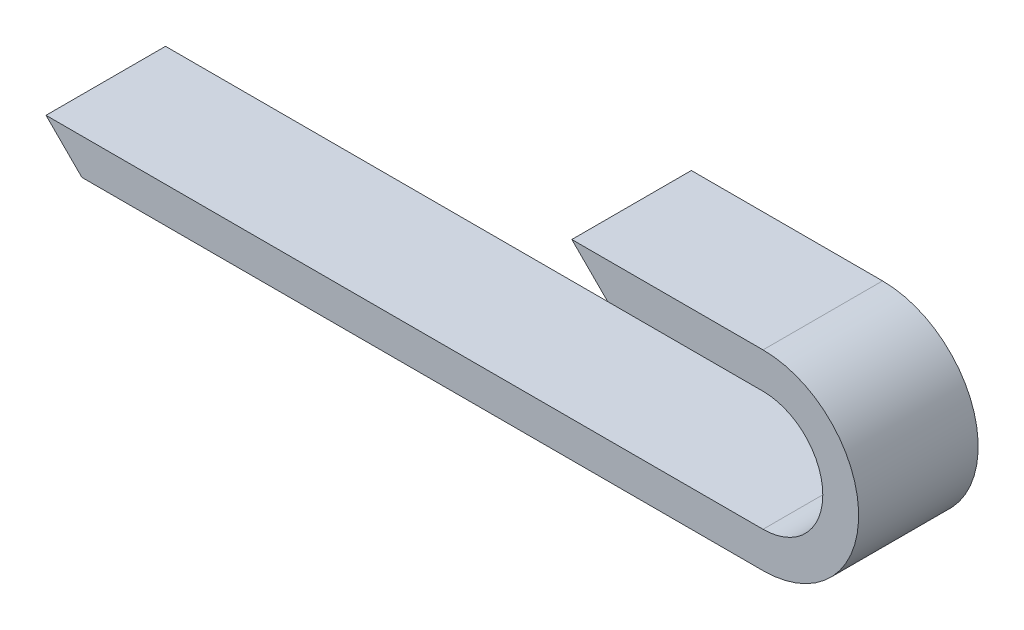
ISO-10303-21;
HEADER;
FILE_DESCRIPTION(('STEP AP214'),'2;1');
FILE_NAME('part.step','',(''),(''),'','','');
FILE_SCHEMA(('AUTOMOTIVE_DESIGN { 1 0 10303 214 1 1 1 1 }'));
ENDSEC;
DATA;
#1=APPLICATION_CONTEXT('core data for automotive mechanical design processes');
#2=APPLICATION_PROTOCOL_DEFINITION('international standard','automotive_design',2000,#1);
#3=PRODUCT_CONTEXT('',#1,'mechanical');
#4=PRODUCT('Part','Part','',(#3));
#5=PRODUCT_RELATED_PRODUCT_CATEGORY('part','',(#4));
#6=PRODUCT_DEFINITION_FORMATION('','',#4);
#7=PRODUCT_DEFINITION_CONTEXT('part definition',#1,'design');
#8=PRODUCT_DEFINITION('design','',#6,#7);
#9=PRODUCT_DEFINITION_SHAPE('','',#8);
#10=(LENGTH_UNIT() NAMED_UNIT(*) SI_UNIT(.MILLI.,.METRE.));
#11=(NAMED_UNIT(*) PLANE_ANGLE_UNIT() SI_UNIT($,.RADIAN.));
#12=(NAMED_UNIT(*) SI_UNIT($,.STERADIAN.) SOLID_ANGLE_UNIT());
#13=UNCERTAINTY_MEASURE_WITH_UNIT(LENGTH_MEASURE(1.E-05),#10,'distance_accuracy_value','');
#14=(GEOMETRIC_REPRESENTATION_CONTEXT(3) GLOBAL_UNCERTAINTY_ASSIGNED_CONTEXT((#13)) GLOBAL_UNIT_ASSIGNED_CONTEXT((#10,
#11,#12)) REPRESENTATION_CONTEXT('',''));
#15=CARTESIAN_POINT('',(0.,0.,0.));
#16=DIRECTION('',(0.,0.,1.));
#17=DIRECTION('',(1.,0.,0.));
#18=AXIS2_PLACEMENT_3D('',#15,#16,#17);
#19=CARTESIAN_POINT('',(325.210180135895,8.42588024175691,-85.));
#20=DIRECTION('',(0.,0.,1.));
#21=DIRECTION('',(1.,0.,0.));
#22=AXIS2_PLACEMENT_3D('',#19,#20,#21);
#23=CYLINDRICAL_SURFACE('',#22,68.);
#24=CARTESIAN_POINT('',(325.210180135895,8.42588024175691,0.));
#25=DIRECTION('',(0.,0.,1.));
#26=DIRECTION('',(1.,0.,0.));
#27=AXIS2_PLACEMENT_3D('',#24,#25,#26);
#28=CIRCLE('',#27,68.);
#29=CARTESIAN_POINT('',(325.210180135895,76.4258802417569,0.));
#30=VERTEX_POINT('',#29);
#31=CARTESIAN_POINT('',(325.210180135895,-59.5741197582431,0.));
#32=VERTEX_POINT('',#31);
#33=EDGE_CURVE('E135',#30,#32,#28,.F.);
#34=ORIENTED_EDGE('',*,*,#33,.T.);
#35=DIRECTION('',(0.,0.,1.));
#36=VECTOR('',#35,1.);
#37=CARTESIAN_POINT('',(325.210180135895,-59.5741197582431,-85.));
#38=LINE('',#37,#36);
#39=CARTESIAN_POINT('',(325.210180135895,-59.5741197582431,-85.));
#40=VERTEX_POINT('',#39);
#41=EDGE_CURVE('E11',#40,#32,#38,.T.);
#42=ORIENTED_EDGE('',*,*,#41,.F.);
#43=CARTESIAN_POINT('',(325.210180135895,8.42588024175691,-85.));
#44=DIRECTION('',(0.,0.,1.));
#45=DIRECTION('',(1.,0.,0.));
#46=AXIS2_PLACEMENT_3D('',#43,#44,#45);
#47=CIRCLE('',#46,68.);
#48=CARTESIAN_POINT('',(325.210180135895,76.4258802417569,-85.));
#49=VERTEX_POINT('',#48);
#50=EDGE_CURVE('E153',#49,#40,#47,.F.);
#51=ORIENTED_EDGE('',*,*,#50,.F.);
#52=DIRECTION('',(0.,0.,1.));
#53=VECTOR('',#52,1.);
#54=CARTESIAN_POINT('',(325.210180135895,76.4258802417569,-85.));
#55=LINE('',#54,#53);
#56=EDGE_CURVE('E41',#49,#30,#55,.T.);
#57=ORIENTED_EDGE('',*,*,#56,.T.);
#58=EDGE_LOOP('',(#34,#42,#51,#57));
#59=FACE_BOUND('',#58,.T.);
#60=ADVANCED_FACE('F38',(#59),#23,.T.);
#61=CARTESIAN_POINT('',(0.,-59.5741197582431,-85.));
#62=DIRECTION('',(0.,1.,0.));
#63=DIRECTION('',(-1.,0.,0.));
#64=AXIS2_PLACEMENT_3D('',#61,#62,#63);
#65=PLANE('',#64);
#66=DIRECTION('',(-1.,0.,0.));
#67=VECTOR('',#66,1.);
#68=CARTESIAN_POINT('',(0.,-59.5741197582431,0.));
#69=LINE('',#68,#67);
#70=CARTESIAN_POINT('',(-159.289819864105,-59.5741197582431,0.));
#71=VERTEX_POINT('',#70);
#72=EDGE_CURVE('E81',#32,#71,#69,.T.);
#73=ORIENTED_EDGE('',*,*,#72,.T.);
#74=DIRECTION('',(0.,0.,1.));
#75=VECTOR('',#74,1.);
#76=CARTESIAN_POINT('',(-159.289819864105,-59.5741197582431,-85.));
#77=LINE('',#76,#75);
#78=CARTESIAN_POINT('',(-159.289819864105,-59.5741197582431,-85.));
#79=VERTEX_POINT('',#78);
#80=EDGE_CURVE('E47',#79,#71,#77,.T.);
#81=ORIENTED_EDGE('',*,*,#80,.F.);
#82=DIRECTION('',(-1.,0.,0.));
#83=VECTOR('',#82,1.);
#84=CARTESIAN_POINT('',(0.,-59.5741197582431,-85.));
#85=LINE('',#84,#83);
#86=EDGE_CURVE('E55',#40,#79,#85,.T.);
#87=ORIENTED_EDGE('',*,*,#86,.F.);
#88=ORIENTED_EDGE('',*,*,#41,.T.);
#89=EDGE_LOOP('',(#73,#81,#87,#88));
#90=FACE_BOUND('',#89,.T.);
#91=ADVANCED_FACE('F178',(#90),#65,.F.);
#92=CARTESIAN_POINT('',(-109.431969811174,-109.431969811174,-85.));
#93=DIRECTION('',(0.707106781186548,0.707106781186548,0.));
#94=DIRECTION('',(-0.707106781186548,0.707106781186548,0.));
#95=AXIS2_PLACEMENT_3D('',#92,#93,#94);
#96=PLANE('',#95);
#97=DIRECTION('',(-0.707106781186548,0.707106781186548,0.));
#98=VECTOR('',#97,1.);
#99=CARTESIAN_POINT('',(-109.431969811174,-109.431969811174,0.));
#100=LINE('',#99,#98);
#101=CARTESIAN_POINT('',(-184.789819864105,-34.0741197582431,0.));
#102=VERTEX_POINT('',#101);
#103=EDGE_CURVE('E120',#71,#102,#100,.T.);
#104=ORIENTED_EDGE('',*,*,#103,.T.);
#105=DIRECTION('',(0.,0.,1.));
#106=VECTOR('',#105,1.);
#107=CARTESIAN_POINT('',(-184.789819864105,-34.0741197582431,-85.));
#108=LINE('',#107,#106);
#109=CARTESIAN_POINT('',(-184.789819864105,-34.0741197582431,-85.));
#110=VERTEX_POINT('',#109);
#111=EDGE_CURVE('E118',#110,#102,#108,.T.);
#112=ORIENTED_EDGE('',*,*,#111,.F.);
#113=DIRECTION('',(-0.707106781186548,0.707106781186548,0.));
#114=VECTOR('',#113,1.);
#115=CARTESIAN_POINT('',(-109.431969811174,-109.431969811174,-85.));
#116=LINE('',#115,#114);
#117=EDGE_CURVE('E108',#79,#110,#116,.T.);
#118=ORIENTED_EDGE('',*,*,#117,.F.);
#119=ORIENTED_EDGE('',*,*,#80,.T.);
#120=EDGE_LOOP('',(#104,#112,#118,#119));
#121=FACE_BOUND('',#120,.T.);
#122=ADVANCED_FACE('F119',(#121),#96,.F.);
#123=CARTESIAN_POINT('',(0.,-34.0741197582431,-85.));
#124=DIRECTION('',(0.,-1.,0.));
#125=DIRECTION('',(1.,0.,0.));
#126=AXIS2_PLACEMENT_3D('',#123,#124,#125);
#127=PLANE('',#126);
#128=DIRECTION('',(1.,0.,0.));
#129=VECTOR('',#128,1.);
#130=CARTESIAN_POINT('',(0.,-34.0741197582431,0.));
#131=LINE('',#130,#129);
#132=CARTESIAN_POINT('',(325.210180135895,-34.0741197582431,0.));
#133=VERTEX_POINT('',#132);
#134=EDGE_CURVE('E150',#102,#133,#131,.T.);
#135=ORIENTED_EDGE('',*,*,#134,.T.);
#136=DIRECTION('',(0.,0.,1.));
#137=VECTOR('',#136,1.);
#138=CARTESIAN_POINT('',(325.210180135895,-34.0741197582431,-85.));
#139=LINE('',#138,#137);
#140=CARTESIAN_POINT('',(325.210180135895,-34.0741197582431,-85.));
#141=VERTEX_POINT('',#140);
#142=EDGE_CURVE('E124',#141,#133,#139,.T.);
#143=ORIENTED_EDGE('',*,*,#142,.F.);
#144=DIRECTION('',(1.,0.,0.));
#145=VECTOR('',#144,1.);
#146=CARTESIAN_POINT('',(0.,-34.0741197582431,-85.));
#147=LINE('',#146,#145);
#148=EDGE_CURVE('E113',#110,#141,#147,.T.);
#149=ORIENTED_EDGE('',*,*,#148,.F.);
#150=ORIENTED_EDGE('',*,*,#111,.T.);
#151=EDGE_LOOP('',(#135,#143,#149,#150));
#152=FACE_BOUND('',#151,.T.);
#153=ADVANCED_FACE('F126',(#152),#127,.F.);
#154=CARTESIAN_POINT('',(325.210180135895,8.42588024175691,-85.));
#155=DIRECTION('',(0.,0.,1.));
#156=DIRECTION('',(1.,0.,0.));
#157=AXIS2_PLACEMENT_3D('',#154,#155,#156);
#158=CYLINDRICAL_SURFACE('',#157,42.5);
#159=CARTESIAN_POINT('',(325.210180135895,8.42588024175691,0.));
#160=DIRECTION('',(0.,0.,1.));
#161=DIRECTION('',(1.,0.,0.));
#162=AXIS2_PLACEMENT_3D('',#159,#160,#161);
#163=CIRCLE('',#162,42.5);
#164=CARTESIAN_POINT('',(325.210180135895,50.9258802417569,0.));
#165=VERTEX_POINT('',#164);
#166=EDGE_CURVE('E147',#165,#133,#163,.F.);
#167=ORIENTED_EDGE('',*,*,#166,.F.);
#168=DIRECTION('',(0.,0.,1.));
#169=VECTOR('',#168,1.);
#170=CARTESIAN_POINT('',(325.210180135895,50.9258802417569,-85.));
#171=LINE('',#170,#169);
#172=CARTESIAN_POINT('',(325.210180135895,50.9258802417569,-85.));
#173=VERTEX_POINT('',#172);
#174=EDGE_CURVE('E157',#173,#165,#171,.T.);
#175=ORIENTED_EDGE('',*,*,#174,.F.);
#176=CARTESIAN_POINT('',(325.210180135895,8.42588024175691,-85.));
#177=DIRECTION('',(0.,0.,1.));
#178=DIRECTION('',(1.,0.,0.));
#179=AXIS2_PLACEMENT_3D('',#176,#177,#178);
#180=CIRCLE('',#179,42.5);
#181=EDGE_CURVE('E128',#173,#141,#180,.F.);
#182=ORIENTED_EDGE('',*,*,#181,.T.);
#183=ORIENTED_EDGE('',*,*,#142,.T.);
#184=EDGE_LOOP('',(#167,#175,#182,#183));
#185=FACE_BOUND('',#184,.T.);
#186=ADVANCED_FACE('F191',(#185),#158,.F.);
#187=CARTESIAN_POINT('',(0.,50.9258802417569,-85.));
#188=DIRECTION('',(0.,1.,0.));
#189=DIRECTION('',(-1.,0.,0.));
#190=AXIS2_PLACEMENT_3D('',#187,#188,#189);
#191=PLANE('',#190);
#192=DIRECTION('',(-1.,0.,0.));
#193=VECTOR('',#192,1.);
#194=CARTESIAN_POINT('',(0.,50.9258802417569,0.));
#195=LINE('',#194,#193);
#196=CARTESIAN_POINT('',(214.710180135895,50.9258802417569,0.));
#197=VERTEX_POINT('',#196);
#198=EDGE_CURVE('E144',#165,#197,#195,.T.);
#199=ORIENTED_EDGE('',*,*,#198,.T.);
#200=DIRECTION('',(0.,0.,1.));
#201=VECTOR('',#200,1.);
#202=CARTESIAN_POINT('',(214.710180135895,50.9258802417569,-85.));
#203=LINE('',#202,#201);
#204=CARTESIAN_POINT('',(214.710180135895,50.9258802417569,-85.));
#205=VERTEX_POINT('',#204);
#206=EDGE_CURVE('E159',#205,#197,#203,.T.);
#207=ORIENTED_EDGE('',*,*,#206,.F.);
#208=DIRECTION('',(-1.,0.,0.));
#209=VECTOR('',#208,1.);
#210=CARTESIAN_POINT('',(0.,50.9258802417569,-85.));
#211=LINE('',#210,#209);
#212=EDGE_CURVE('E130',#173,#205,#211,.T.);
#213=ORIENTED_EDGE('',*,*,#212,.F.);
#214=ORIENTED_EDGE('',*,*,#174,.T.);
#215=EDGE_LOOP('',(#199,#207,#213,#214));
#216=FACE_BOUND('',#215,.T.);
#217=ADVANCED_FACE('F174',(#216),#191,.F.);
#218=CARTESIAN_POINT('',(132.818030188825,132.818030188826,-85.));
#219=DIRECTION('',(-0.707106781186547,-0.707106781186548,0.));
#220=DIRECTION('',(0.707106781186548,-0.707106781186547,0.));
#221=AXIS2_PLACEMENT_3D('',#218,#219,#220);
#222=PLANE('',#221);
#223=DIRECTION('',(0.707106781186548,-0.707106781186547,0.));
#224=VECTOR('',#223,1.);
#225=CARTESIAN_POINT('',(132.818030188825,132.818030188826,0.));
#226=LINE('',#225,#224);
#227=CARTESIAN_POINT('',(189.210180135895,76.4258802417569,0.));
#228=VERTEX_POINT('',#227);
#229=EDGE_CURVE('E141',#228,#197,#226,.T.);
#230=ORIENTED_EDGE('',*,*,#229,.F.);
#231=DIRECTION('',(0.,0.,1.));
#232=VECTOR('',#231,1.);
#233=CARTESIAN_POINT('',(189.210180135895,76.4258802417569,-85.));
#234=LINE('',#233,#232);
#235=CARTESIAN_POINT('',(189.210180135895,76.4258802417569,-85.));
#236=VERTEX_POINT('',#235);
#237=EDGE_CURVE('E160',#236,#228,#234,.T.);
#238=ORIENTED_EDGE('',*,*,#237,.F.);
#239=DIRECTION('',(0.707106781186548,-0.707106781186547,0.));
#240=VECTOR('',#239,1.);
#241=CARTESIAN_POINT('',(132.818030188825,132.818030188826,-85.));
#242=LINE('',#241,#240);
#243=EDGE_CURVE('E205',#236,#205,#242,.T.);
#244=ORIENTED_EDGE('',*,*,#243,.T.);
#245=ORIENTED_EDGE('',*,*,#206,.T.);
#246=EDGE_LOOP('',(#230,#238,#244,#245));
#247=FACE_BOUND('',#246,.T.);
#248=ADVANCED_FACE('F168',(#247),#222,.T.);
#249=CARTESIAN_POINT('',(0.,76.4258802417569,-85.));
#250=DIRECTION('',(0.,1.,0.));
#251=DIRECTION('',(-1.,0.,0.));
#252=AXIS2_PLACEMENT_3D('',#249,#250,#251);
#253=PLANE('',#252);
#254=DIRECTION('',(-1.,0.,0.));
#255=VECTOR('',#254,1.);
#256=CARTESIAN_POINT('',(0.,76.4258802417569,0.));
#257=LINE('',#256,#255);
#258=EDGE_CURVE('E138',#30,#228,#257,.T.);
#259=ORIENTED_EDGE('',*,*,#258,.F.);
#260=ORIENTED_EDGE('',*,*,#56,.F.);
#261=DIRECTION('',(-1.,0.,0.));
#262=VECTOR('',#261,1.);
#263=CARTESIAN_POINT('',(0.,76.4258802417569,-85.));
#264=LINE('',#263,#262);
#265=EDGE_CURVE('E206',#49,#236,#264,.T.);
#266=ORIENTED_EDGE('',*,*,#265,.T.);
#267=ORIENTED_EDGE('',*,*,#237,.T.);
#268=EDGE_LOOP('',(#259,#260,#266,#267));
#269=FACE_BOUND('',#268,.T.);
#270=ADVANCED_FACE('F166',(#269),#253,.T.);
#271=CARTESIAN_POINT('',(0.,0.,-85.));
#272=DIRECTION('',(0.,0.,1.));
#273=DIRECTION('',(1.,0.,0.));
#274=AXIS2_PLACEMENT_3D('',#271,#272,#273);
#275=PLANE('',#274);
#276=ORIENTED_EDGE('',*,*,#50,.T.);
#277=ORIENTED_EDGE('',*,*,#86,.T.);
#278=ORIENTED_EDGE('',*,*,#117,.T.);
#279=ORIENTED_EDGE('',*,*,#148,.T.);
#280=ORIENTED_EDGE('',*,*,#181,.F.);
#281=ORIENTED_EDGE('',*,*,#212,.T.);
#282=ORIENTED_EDGE('',*,*,#243,.F.);
#283=ORIENTED_EDGE('',*,*,#265,.F.);
#284=EDGE_LOOP('',(#276,#277,#278,#279,#280,#281,#282,#283));
#285=FACE_BOUND('',#284,.T.);
#286=ADVANCED_FACE('F110',(#285),#275,.F.);
#287=CARTESIAN_POINT('',(0.,0.,0.));
#288=DIRECTION('',(0.,0.,1.));
#289=DIRECTION('',(1.,0.,0.));
#290=AXIS2_PLACEMENT_3D('',#287,#288,#289);
#291=PLANE('',#290);
#292=ORIENTED_EDGE('',*,*,#33,.F.);
#293=ORIENTED_EDGE('',*,*,#258,.T.);
#294=ORIENTED_EDGE('',*,*,#229,.T.);
#295=ORIENTED_EDGE('',*,*,#198,.F.);
#296=ORIENTED_EDGE('',*,*,#166,.T.);
#297=ORIENTED_EDGE('',*,*,#134,.F.);
#298=ORIENTED_EDGE('',*,*,#103,.F.);
#299=ORIENTED_EDGE('',*,*,#72,.F.);
#300=EDGE_LOOP('',(#292,#293,#294,#295,#296,#297,#298,#299));
#301=FACE_BOUND('',#300,.T.);
#302=ADVANCED_FACE('F165',(#301),#291,.T.);
#303=CLOSED_SHELL('',(#60,#91,#122,#153,#186,#217,#248,#270,#286,#302));
#304=MANIFOLD_SOLID_BREP('B2',#303);
#305=ADVANCED_BREP_SHAPE_REPRESENTATION('',(#18,#304),#14);
#306=SHAPE_DEFINITION_REPRESENTATION(#9,#305);
ENDSEC;
END-ISO-10303-21;
